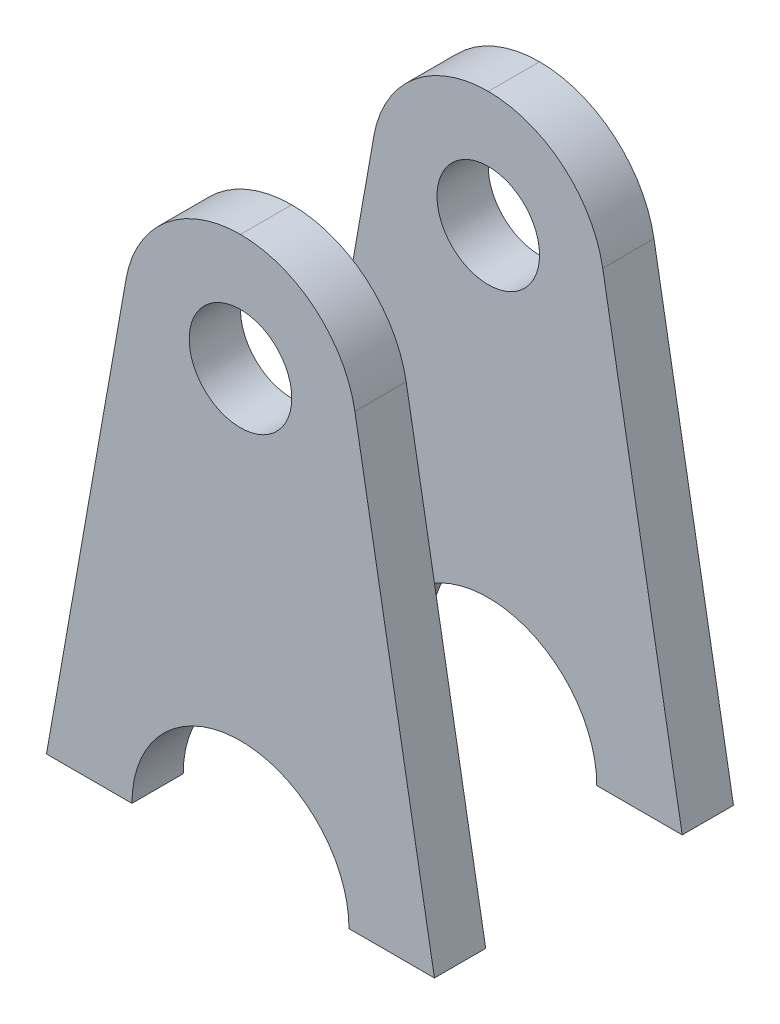
ISO-10303-21;
HEADER;
FILE_DESCRIPTION(('STEP AP214'),'2;1');
FILE_NAME('part.step','',(''),(''),'','','');
FILE_SCHEMA(('AUTOMOTIVE_DESIGN { 1 0 10303 214 1 1 1 1 }'));
ENDSEC;
DATA;
#1=APPLICATION_CONTEXT('core data for automotive mechanical design processes');
#2=APPLICATION_PROTOCOL_DEFINITION('international standard','automotive_design',2000,#1);
#3=PRODUCT_CONTEXT('',#1,'mechanical');
#4=PRODUCT('Part','Part','',(#3));
#5=PRODUCT_RELATED_PRODUCT_CATEGORY('part','',(#4));
#6=PRODUCT_DEFINITION_FORMATION('','',#4);
#7=PRODUCT_DEFINITION_CONTEXT('part definition',#1,'design');
#8=PRODUCT_DEFINITION('design','',#6,#7);
#9=PRODUCT_DEFINITION_SHAPE('','',#8);
#10=(LENGTH_UNIT() NAMED_UNIT(*) SI_UNIT(.MILLI.,.METRE.));
#11=(NAMED_UNIT(*) PLANE_ANGLE_UNIT() SI_UNIT($,.RADIAN.));
#12=(NAMED_UNIT(*) SI_UNIT($,.STERADIAN.) SOLID_ANGLE_UNIT());
#13=UNCERTAINTY_MEASURE_WITH_UNIT(LENGTH_MEASURE(1.E-05),#10,'distance_accuracy_value','');
#14=(GEOMETRIC_REPRESENTATION_CONTEXT(3) GLOBAL_UNCERTAINTY_ASSIGNED_CONTEXT((#13)) GLOBAL_UNIT_ASSIGNED_CONTEXT((#10,
#11,#12)) REPRESENTATION_CONTEXT('',''));
#15=CARTESIAN_POINT('',(0.,0.,0.));
#16=DIRECTION('',(0.,0.,1.));
#17=DIRECTION('',(1.,0.,0.));
#18=AXIS2_PLACEMENT_3D('',#15,#16,#17);
#19=CARTESIAN_POINT('',(0.,64.0125039457935,-29.));
#20=DIRECTION('',(0.,1.,0.));
#21=DIRECTION('',(0.,0.,-1.));
#22=AXIS2_PLACEMENT_3D('',#19,#20,#21);
#23=PLANE('',#22);
#24=DIRECTION('',(1.,0.,0.));
#25=VECTOR('',#24,1.);
#26=CARTESIAN_POINT('',(0.,64.0125039457935,-23.));
#27=LINE('',#26,#25);
#28=CARTESIAN_POINT('',(55.1993694108853,64.0125039457935,-23.));
#29=VERTEX_POINT('',#28);
#30=CARTESIAN_POINT('',(55.2015963461622,64.0125039457935,-23.));
#31=VERTEX_POINT('',#30);
#32=EDGE_CURVE('E153',#29,#31,#27,.T.);
#33=ORIENTED_EDGE('',*,*,#32,.T.);
#34=DIRECTION('',(0.,0.,1.));
#35=VECTOR('',#34,1.);
#36=CARTESIAN_POINT('',(55.2015963461622,64.0125039457935,-29.));
#37=LINE('',#36,#35);
#38=CARTESIAN_POINT('',(55.2015963461622,64.0125039457935,-29.));
#39=VERTEX_POINT('',#38);
#40=EDGE_CURVE('E149',#39,#31,#37,.T.);
#41=ORIENTED_EDGE('',*,*,#40,.F.);
#42=DIRECTION('',(1.,0.,0.));
#43=VECTOR('',#42,1.);
#44=CARTESIAN_POINT('',(0.,64.0125039457935,-29.));
#45=LINE('',#44,#43);
#46=CARTESIAN_POINT('',(55.1993694108853,64.0125039457935,-29.));
#47=VERTEX_POINT('',#46);
#48=EDGE_CURVE('E190',#47,#39,#45,.T.);
#49=ORIENTED_EDGE('',*,*,#48,.F.);
#50=DIRECTION('',(0.,0.,1.));
#51=VECTOR('',#50,1.);
#52=CARTESIAN_POINT('',(55.1993694108853,64.0125039457935,-29.));
#53=LINE('',#52,#51);
#54=EDGE_CURVE('E12',#47,#29,#53,.T.);
#55=ORIENTED_EDGE('',*,*,#54,.T.);
#56=EDGE_LOOP('',(#33,#41,#49,#55));
#57=FACE_BOUND('',#56,.T.);
#58=ADVANCED_FACE('F53',(#57),#23,.T.);
#59=CARTESIAN_POINT('',(55.1993694108852,50.4125039457935,-29.));
#60=DIRECTION('',(0.,0.,1.));
#61=DIRECTION('',(-1.,0.,0.));
#62=AXIS2_PLACEMENT_3D('',#59,#60,#61);
#63=CYLINDRICAL_SURFACE('',#62,13.6);
#64=CARTESIAN_POINT('',(55.1993694108852,50.4125039457935,-23.));
#65=DIRECTION('',(0.,0.,1.));
#66=DIRECTION('',(1.,0.,0.));
#67=AXIS2_PLACEMENT_3D('',#64,#65,#66);
#68=CIRCLE('',#67,13.6);
#69=CARTESIAN_POINT('',(41.8059839699192,52.7741191620637,-23.));
#70=VERTEX_POINT('',#69);
#71=EDGE_CURVE('E156',#29,#70,#68,.T.);
#72=ORIENTED_EDGE('',*,*,#71,.F.);
#73=ORIENTED_EDGE('',*,*,#54,.F.);
#74=CARTESIAN_POINT('',(55.1993694108852,50.4125039457935,-29.));
#75=DIRECTION('',(0.,0.,1.));
#76=DIRECTION('',(1.,0.,0.));
#77=AXIS2_PLACEMENT_3D('',#74,#75,#76);
#78=CIRCLE('',#77,13.6);
#79=CARTESIAN_POINT('',(41.8059839699192,52.7741191620637,-29.));
#80=VERTEX_POINT('',#79);
#81=EDGE_CURVE('E108',#47,#80,#78,.T.);
#82=ORIENTED_EDGE('',*,*,#81,.T.);
#83=DIRECTION('',(0.,0.,1.));
#84=VECTOR('',#83,1.);
#85=CARTESIAN_POINT('',(41.8059839699192,52.7741191620637,-29.));
#86=LINE('',#85,#84);
#87=EDGE_CURVE('E62',#80,#70,#86,.T.);
#88=ORIENTED_EDGE('',*,*,#87,.T.);
#89=EDGE_LOOP('',(#72,#73,#82,#88));
#90=FACE_BOUND('',#89,.T.);
#91=ADVANCED_FACE('F182',(#90),#63,.T.);
#92=CARTESIAN_POINT('',(31.5204734057258,-5.557909906133,-29.));
#93=DIRECTION('',(-0.984807753012208,0.173648177666927,0.));
#94=DIRECTION('',(-0.173648177666927,-0.984807753012209,0.));
#95=AXIS2_PLACEMENT_3D('',#92,#93,#94);
#96=PLANE('',#95);
#97=DIRECTION('',(0.173648177666927,0.984807753012209,0.));
#98=VECTOR('',#97,1.);
#99=CARTESIAN_POINT('',(31.5204734057258,-5.557909906133,-23.));
#100=LINE('',#99,#98);
#101=CARTESIAN_POINT('',(32.5004828785239,0.,-23.));
#102=VERTEX_POINT('',#101);
#103=EDGE_CURVE('E159',#102,#70,#100,.T.);
#104=ORIENTED_EDGE('',*,*,#103,.T.);
#105=ORIENTED_EDGE('',*,*,#87,.F.);
#106=DIRECTION('',(0.173648177666927,0.984807753012209,0.));
#107=VECTOR('',#106,1.);
#108=CARTESIAN_POINT('',(31.5204734057258,-5.557909906133,-29.));
#109=LINE('',#108,#107);
#110=CARTESIAN_POINT('',(32.5004828785239,0.,-29.));
#111=VERTEX_POINT('',#110);
#112=EDGE_CURVE('E192',#111,#80,#109,.T.);
#113=ORIENTED_EDGE('',*,*,#112,.F.);
#114=DIRECTION('',(0.,0.,1.));
#115=VECTOR('',#114,1.);
#116=CARTESIAN_POINT('',(32.5004828785239,0.,-29.));
#117=LINE('',#116,#115);
#118=EDGE_CURVE('E177',#111,#102,#117,.T.);
#119=ORIENTED_EDGE('',*,*,#118,.T.);
#120=EDGE_LOOP('',(#104,#105,#113,#119));
#121=FACE_BOUND('',#120,.T.);
#122=ADVANCED_FACE('F205',(#121),#96,.T.);
#123=CARTESIAN_POINT('',(0.,0.,-29.));
#124=DIRECTION('',(0.,1.,0.));
#125=DIRECTION('',(0.,0.,-1.));
#126=AXIS2_PLACEMENT_3D('',#123,#124,#125);
#127=PLANE('',#126);
#128=DIRECTION('',(1.,0.,0.));
#129=VECTOR('',#128,1.);
#130=CARTESIAN_POINT('',(0.,0.,-23.));
#131=LINE('',#130,#129);
#132=CARTESIAN_POINT('',(42.5004828785239,0.,-23.));
#133=VERTEX_POINT('',#132);
#134=EDGE_CURVE('E161',#102,#133,#131,.T.);
#135=ORIENTED_EDGE('',*,*,#134,.F.);
#136=ORIENTED_EDGE('',*,*,#118,.F.);
#137=DIRECTION('',(1.,0.,0.));
#138=VECTOR('',#137,1.);
#139=CARTESIAN_POINT('',(0.,0.,-29.));
#140=LINE('',#139,#138);
#141=CARTESIAN_POINT('',(42.5004828785239,0.,-29.));
#142=VERTEX_POINT('',#141);
#143=EDGE_CURVE('E144',#111,#142,#140,.T.);
#144=ORIENTED_EDGE('',*,*,#143,.T.);
#145=DIRECTION('',(0.,0.,1.));
#146=VECTOR('',#145,1.);
#147=CARTESIAN_POINT('',(42.5004828785239,0.,-29.));
#148=LINE('',#147,#146);
#149=EDGE_CURVE('E174',#142,#133,#148,.T.);
#150=ORIENTED_EDGE('',*,*,#149,.T.);
#151=EDGE_LOOP('',(#135,#136,#144,#150));
#152=FACE_BOUND('',#151,.T.);
#153=ADVANCED_FACE('F200',(#152),#127,.F.);
#154=CARTESIAN_POINT('',(55.2004828785239,0.,-29.));
#155=DIRECTION('',(0.,0.,1.));
#156=DIRECTION('',(-1.,0.,0.));
#157=AXIS2_PLACEMENT_3D('',#154,#155,#156);
#158=CYLINDRICAL_SURFACE('',#157,12.7);
#159=CARTESIAN_POINT('',(55.2004828785239,0.,-23.));
#160=DIRECTION('',(0.,0.,1.));
#161=DIRECTION('',(1.,0.,0.));
#162=AXIS2_PLACEMENT_3D('',#159,#160,#161);
#163=CIRCLE('',#162,12.7);
#164=CARTESIAN_POINT('',(67.9004828785239,0.,-23.));
#165=VERTEX_POINT('',#164);
#166=EDGE_CURVE('E164',#165,#133,#163,.T.);
#167=ORIENTED_EDGE('',*,*,#166,.T.);
#168=ORIENTED_EDGE('',*,*,#149,.F.);
#169=CARTESIAN_POINT('',(55.2004828785239,0.,-29.));
#170=DIRECTION('',(0.,0.,1.));
#171=DIRECTION('',(1.,0.,0.));
#172=AXIS2_PLACEMENT_3D('',#169,#170,#171);
#173=CIRCLE('',#172,12.7);
#174=CARTESIAN_POINT('',(67.9004828785239,0.,-29.));
#175=VERTEX_POINT('',#174);
#176=EDGE_CURVE('E142',#175,#142,#173,.T.);
#177=ORIENTED_EDGE('',*,*,#176,.F.);
#178=DIRECTION('',(0.,0.,1.));
#179=VECTOR('',#178,1.);
#180=CARTESIAN_POINT('',(67.9004828785239,0.,-29.));
#181=LINE('',#180,#179);
#182=EDGE_CURVE('E136',#175,#165,#181,.T.);
#183=ORIENTED_EDGE('',*,*,#182,.T.);
#184=EDGE_LOOP('',(#167,#168,#177,#183));
#185=FACE_BOUND('',#184,.T.);
#186=ADVANCED_FACE('F203',(#185),#158,.F.);
#187=CARTESIAN_POINT('',(0.,0.,-29.));
#188=DIRECTION('',(0.,1.,0.));
#189=DIRECTION('',(0.,0.,-1.));
#190=AXIS2_PLACEMENT_3D('',#187,#188,#189);
#191=PLANE('',#190);
#192=DIRECTION('',(1.,0.,0.));
#193=VECTOR('',#192,1.);
#194=CARTESIAN_POINT('',(0.,0.,-23.));
#195=LINE('',#194,#193);
#196=CARTESIAN_POINT('',(77.9004828785239,0.,-23.));
#197=VERTEX_POINT('',#196);
#198=EDGE_CURVE('E166',#165,#197,#195,.T.);
#199=ORIENTED_EDGE('',*,*,#198,.F.);
#200=ORIENTED_EDGE('',*,*,#182,.F.);
#201=DIRECTION('',(1.,0.,0.));
#202=VECTOR('',#201,1.);
#203=CARTESIAN_POINT('',(0.,0.,-29.));
#204=LINE('',#203,#202);
#205=CARTESIAN_POINT('',(77.9004828785239,0.,-29.));
#206=VERTEX_POINT('',#205);
#207=EDGE_CURVE('E126',#175,#206,#204,.T.);
#208=ORIENTED_EDGE('',*,*,#207,.T.);
#209=DIRECTION('',(0.,0.,1.));
#210=VECTOR('',#209,1.);
#211=CARTESIAN_POINT('',(77.9004828785239,0.,-29.));
#212=LINE('',#211,#210);
#213=EDGE_CURVE('E131',#206,#197,#212,.T.);
#214=ORIENTED_EDGE('',*,*,#213,.T.);
#215=EDGE_LOOP('',(#199,#200,#208,#214));
#216=FACE_BOUND('',#215,.T.);
#217=ADVANCED_FACE('F139',(#216),#191,.F.);
#218=CARTESIAN_POINT('',(75.5514958975658,13.3217671596261,-29.));
#219=DIRECTION('',(-0.984807753012207,-0.173648177666935,0.));
#220=DIRECTION('',(0.173648177666935,-0.984807753012207,0.));
#221=AXIS2_PLACEMENT_3D('',#218,#219,#220);
#222=PLANE('',#221);
#223=DIRECTION('',(-0.173648177666935,0.984807753012207,0.));
#224=VECTOR('',#223,1.);
#225=CARTESIAN_POINT('',(75.5514958975658,13.3217671596261,-23.));
#226=LINE('',#225,#224);
#227=CARTESIAN_POINT('',(68.5949817871282,52.7741191620638,-23.));
#228=VERTEX_POINT('',#227);
#229=EDGE_CURVE('E133',#197,#228,#226,.T.);
#230=ORIENTED_EDGE('',*,*,#229,.F.);
#231=ORIENTED_EDGE('',*,*,#213,.F.);
#232=DIRECTION('',(-0.173648177666935,0.984807753012207,0.));
#233=VECTOR('',#232,1.);
#234=CARTESIAN_POINT('',(75.5514958975658,13.3217671596261,-29.));
#235=LINE('',#234,#233);
#236=CARTESIAN_POINT('',(68.5949817871282,52.7741191620638,-29.));
#237=VERTEX_POINT('',#236);
#238=EDGE_CURVE('E122',#206,#237,#235,.T.);
#239=ORIENTED_EDGE('',*,*,#238,.T.);
#240=DIRECTION('',(0.,0.,1.));
#241=VECTOR('',#240,1.);
#242=CARTESIAN_POINT('',(68.5949817871282,52.7741191620638,-29.));
#243=LINE('',#242,#241);
#244=EDGE_CURVE('E137',#237,#228,#243,.T.);
#245=ORIENTED_EDGE('',*,*,#244,.T.);
#246=EDGE_LOOP('',(#230,#231,#239,#245));
#247=FACE_BOUND('',#246,.T.);
#248=ADVANCED_FACE('F132',(#247),#222,.F.);
#249=CARTESIAN_POINT('',(55.2015963461622,50.4125039457935,-29.));
#250=DIRECTION('',(0.,0.,1.));
#251=DIRECTION('',(-1.,0.,0.));
#252=AXIS2_PLACEMENT_3D('',#249,#250,#251);
#253=CYLINDRICAL_SURFACE('',#252,6.00000000000001);
#254=CARTESIAN_POINT('',(55.2015963461622,50.4125039457935,-29.));
#255=DIRECTION('',(0.,0.,1.));
#256=DIRECTION('',(1.,0.,0.));
#257=AXIS2_PLACEMENT_3D('',#254,#255,#256);
#258=CIRCLE('',#257,6.00000000000001);
#259=CARTESIAN_POINT('',(61.2015963461622,50.4125039457935,-29.));
#260=VERTEX_POINT('',#259);
#261=EDGE_CURVE('E170',#260,#260,#258,.T.);
#262=ORIENTED_EDGE('',*,*,#261,.F.);
#263=EDGE_LOOP('',(#262));
#264=FACE_BOUND('',#263,.T.);
#265=CARTESIAN_POINT('',(55.2015963461622,50.4125039457935,-23.));
#266=DIRECTION('',(0.,0.,1.));
#267=DIRECTION('',(1.,0.,0.));
#268=AXIS2_PLACEMENT_3D('',#265,#266,#267);
#269=CIRCLE('',#268,6.00000000000001);
#270=CARTESIAN_POINT('',(61.2015963461622,50.4125039457935,-23.));
#271=VERTEX_POINT('',#270);
#272=EDGE_CURVE('E150',#271,#271,#269,.T.);
#273=ORIENTED_EDGE('',*,*,#272,.T.);
#274=EDGE_LOOP('',(#273));
#275=FACE_BOUND('',#274,.T.);
#276=ADVANCED_FACE('F55',(#264,#275),#253,.F.);
#277=CARTESIAN_POINT('',(55.2015963461622,50.4125039457935,-29.));
#278=DIRECTION('',(0.,0.,1.));
#279=DIRECTION('',(-1.,0.,0.));
#280=AXIS2_PLACEMENT_3D('',#277,#278,#279);
#281=CYLINDRICAL_SURFACE('',#280,13.6);
#282=CARTESIAN_POINT('',(55.2015963461622,50.4125039457935,-23.));
#283=DIRECTION('',(0.,0.,1.));
#284=DIRECTION('',(1.,0.,0.));
#285=AXIS2_PLACEMENT_3D('',#282,#283,#284);
#286=CIRCLE('',#285,13.6);
#287=EDGE_CURVE('E96',#31,#228,#286,.F.);
#288=ORIENTED_EDGE('',*,*,#287,.T.);
#289=ORIENTED_EDGE('',*,*,#244,.F.);
#290=CARTESIAN_POINT('',(55.2015963461622,50.4125039457935,-29.));
#291=DIRECTION('',(0.,0.,1.));
#292=DIRECTION('',(1.,0.,0.));
#293=AXIS2_PLACEMENT_3D('',#290,#291,#292);
#294=CIRCLE('',#293,13.6);
#295=EDGE_CURVE('E70',#39,#237,#294,.F.);
#296=ORIENTED_EDGE('',*,*,#295,.F.);
#297=ORIENTED_EDGE('',*,*,#40,.T.);
#298=EDGE_LOOP('',(#288,#289,#296,#297));
#299=FACE_BOUND('',#298,.T.);
#300=ADVANCED_FACE('F264',(#299),#281,.T.);
#301=CARTESIAN_POINT('',(0.,0.,-29.));
#302=DIRECTION('',(0.,0.,-1.));
#303=DIRECTION('',(1.,0.,0.));
#304=AXIS2_PLACEMENT_3D('',#301,#302,#303);
#305=PLANE('',#304);
#306=ORIENTED_EDGE('',*,*,#261,.T.);
#307=EDGE_LOOP('',(#306));
#308=FACE_BOUND('',#307,.T.);
#309=ORIENTED_EDGE('',*,*,#48,.T.);
#310=ORIENTED_EDGE('',*,*,#295,.T.);
#311=ORIENTED_EDGE('',*,*,#238,.F.);
#312=ORIENTED_EDGE('',*,*,#207,.F.);
#313=ORIENTED_EDGE('',*,*,#176,.T.);
#314=ORIENTED_EDGE('',*,*,#143,.F.);
#315=ORIENTED_EDGE('',*,*,#112,.T.);
#316=ORIENTED_EDGE('',*,*,#81,.F.);
#317=EDGE_LOOP('',(#309,#310,#311,#312,#313,#314,#315,#316));
#318=FACE_BOUND('',#317,.T.);
#319=ADVANCED_FACE('F124',(#308,#318),#305,.T.);
#320=CARTESIAN_POINT('',(0.,0.,-23.));
#321=DIRECTION('',(0.,0.,-1.));
#322=DIRECTION('',(1.,0.,0.));
#323=AXIS2_PLACEMENT_3D('',#320,#321,#322);
#324=PLANE('',#323);
#325=ORIENTED_EDGE('',*,*,#272,.F.);
#326=EDGE_LOOP('',(#325));
#327=FACE_BOUND('',#326,.T.);
#328=ORIENTED_EDGE('',*,*,#32,.F.);
#329=ORIENTED_EDGE('',*,*,#71,.T.);
#330=ORIENTED_EDGE('',*,*,#103,.F.);
#331=ORIENTED_EDGE('',*,*,#134,.T.);
#332=ORIENTED_EDGE('',*,*,#166,.F.);
#333=ORIENTED_EDGE('',*,*,#198,.T.);
#334=ORIENTED_EDGE('',*,*,#229,.T.);
#335=ORIENTED_EDGE('',*,*,#287,.F.);
#336=EDGE_LOOP('',(#328,#329,#330,#331,#332,#333,#334,#335));
#337=FACE_BOUND('',#336,.T.);
#338=ADVANCED_FACE('F186',(#327,#337),#324,.F.);
#339=CLOSED_SHELL('',(#58,#91,#122,#153,#186,#217,#248,#276,#300,#319,#338));
#340=MANIFOLD_SOLID_BREP('B2',#339);
#341=CARTESIAN_POINT('',(0.,64.0125039457935,6.));
#342=DIRECTION('',(0.,1.,0.));
#343=DIRECTION('',(0.,0.,1.));
#344=AXIS2_PLACEMENT_3D('',#341,#342,#343);
#345=PLANE('',#344);
#346=DIRECTION('',(1.,0.,0.));
#347=VECTOR('',#346,1.);
#348=CARTESIAN_POINT('',(0.,64.0125039457935,0.));
#349=LINE('',#348,#347);
#350=CARTESIAN_POINT('',(55.1993694108853,64.0125039457935,0.));
#351=VERTEX_POINT('',#350);
#352=CARTESIAN_POINT('',(55.2015963461622,64.0125039457935,0.));
#353=VERTEX_POINT('',#352);
#354=EDGE_CURVE('E465',#351,#353,#349,.T.);
#355=ORIENTED_EDGE('',*,*,#354,.F.);
#356=DIRECTION('',(0.,0.,-1.));
#357=VECTOR('',#356,1.);
#358=CARTESIAN_POINT('',(55.1993694108853,64.0125039457935,6.));
#359=LINE('',#358,#357);
#360=CARTESIAN_POINT('',(55.1993694108853,64.0125039457935,6.));
#361=VERTEX_POINT('',#360);
#362=EDGE_CURVE('E51',#361,#351,#359,.T.);
#363=ORIENTED_EDGE('',*,*,#362,.F.);
#364=DIRECTION('',(1.,0.,0.));
#365=VECTOR('',#364,1.);
#366=CARTESIAN_POINT('',(0.,64.0125039457935,6.));
#367=LINE('',#366,#365);
#368=CARTESIAN_POINT('',(55.2015963461622,64.0125039457935,6.));
#369=VERTEX_POINT('',#368);
#370=EDGE_CURVE('E641',#361,#369,#367,.T.);
#371=ORIENTED_EDGE('',*,*,#370,.T.);
#372=DIRECTION('',(0.,0.,-1.));
#373=VECTOR('',#372,1.);
#374=CARTESIAN_POINT('',(55.2015963461622,64.0125039457935,6.));
#375=LINE('',#374,#373);
#376=EDGE_CURVE('E369',#369,#353,#375,.T.);
#377=ORIENTED_EDGE('',*,*,#376,.T.);
#378=EDGE_LOOP('',(#355,#363,#371,#377));
#379=FACE_BOUND('',#378,.T.);
#380=ADVANCED_FACE('F352',(#379),#345,.T.);
#381=CARTESIAN_POINT('',(55.1993694108852,50.4125039457935,6.));
#382=DIRECTION('',(0.,0.,-1.));
#383=DIRECTION('',(-1.,0.,0.));
#384=AXIS2_PLACEMENT_3D('',#381,#382,#383);
#385=CYLINDRICAL_SURFACE('',#384,13.6);
#386=CARTESIAN_POINT('',(55.1993694108852,50.4125039457935,0.));
#387=DIRECTION('',(0.,0.,1.));
#388=DIRECTION('',(1.,0.,0.));
#389=AXIS2_PLACEMENT_3D('',#386,#387,#388);
#390=CIRCLE('',#389,13.6);
#391=CARTESIAN_POINT('',(41.8059839699192,52.7741191620637,0.));
#392=VERTEX_POINT('',#391);
#393=EDGE_CURVE('E462',#351,#392,#390,.T.);
#394=ORIENTED_EDGE('',*,*,#393,.T.);
#395=DIRECTION('',(0.,0.,-1.));
#396=VECTOR('',#395,1.);
#397=CARTESIAN_POINT('',(41.8059839699192,52.7741191620637,6.));
#398=LINE('',#397,#396);
#399=CARTESIAN_POINT('',(41.8059839699192,52.7741191620637,6.));
#400=VERTEX_POINT('',#399);
#401=EDGE_CURVE('E361',#400,#392,#398,.T.);
#402=ORIENTED_EDGE('',*,*,#401,.F.);
#403=CARTESIAN_POINT('',(55.1993694108852,50.4125039457935,6.));
#404=DIRECTION('',(0.,0.,1.));
#405=DIRECTION('',(1.,0.,0.));
#406=AXIS2_PLACEMENT_3D('',#403,#404,#405);
#407=CIRCLE('',#406,13.6);
#408=EDGE_CURVE('E639',#361,#400,#407,.T.);
#409=ORIENTED_EDGE('',*,*,#408,.F.);
#410=ORIENTED_EDGE('',*,*,#362,.T.);
#411=EDGE_LOOP('',(#394,#402,#409,#410));
#412=FACE_BOUND('',#411,.T.);
#413=ADVANCED_FACE('F463',(#412),#385,.T.);
#414=CARTESIAN_POINT('',(31.5204734057258,-5.557909906133,6.));
#415=DIRECTION('',(-0.984807753012208,0.173648177666927,0.));
#416=DIRECTION('',(-0.173648177666927,-0.984807753012209,0.));
#417=AXIS2_PLACEMENT_3D('',#414,#415,#416);
#418=PLANE('',#417);
#419=DIRECTION('',(0.173648177666927,0.984807753012209,0.));
#420=VECTOR('',#419,1.);
#421=CARTESIAN_POINT('',(31.5204734057258,-5.557909906133,0.));
#422=LINE('',#421,#420);
#423=CARTESIAN_POINT('',(32.5004828785239,0.,0.));
#424=VERTEX_POINT('',#423);
#425=EDGE_CURVE('E457',#424,#392,#422,.T.);
#426=ORIENTED_EDGE('',*,*,#425,.F.);
#427=DIRECTION('',(0.,0.,-1.));
#428=VECTOR('',#427,1.);
#429=CARTESIAN_POINT('',(32.5004828785239,0.,6.));
#430=LINE('',#429,#428);
#431=CARTESIAN_POINT('',(32.5004828785239,0.,6.));
#432=VERTEX_POINT('',#431);
#433=EDGE_CURVE('E449',#432,#424,#430,.T.);
#434=ORIENTED_EDGE('',*,*,#433,.F.);
#435=DIRECTION('',(0.173648177666927,0.984807753012209,0.));
#436=VECTOR('',#435,1.);
#437=CARTESIAN_POINT('',(31.5204734057258,-5.557909906133,6.));
#438=LINE('',#437,#436);
#439=EDGE_CURVE('E459',#432,#400,#438,.T.);
#440=ORIENTED_EDGE('',*,*,#439,.T.);
#441=ORIENTED_EDGE('',*,*,#401,.T.);
#442=EDGE_LOOP('',(#426,#434,#440,#441));
#443=FACE_BOUND('',#442,.T.);
#444=ADVANCED_FACE('F455',(#443),#418,.T.);
#445=CARTESIAN_POINT('',(0.,0.,6.));
#446=DIRECTION('',(0.,1.,0.));
#447=DIRECTION('',(0.,0.,1.));
#448=AXIS2_PLACEMENT_3D('',#445,#446,#447);
#449=PLANE('',#448);
#450=DIRECTION('',(1.,0.,0.));
#451=VECTOR('',#450,1.);
#452=CARTESIAN_POINT('',(0.,0.,0.));
#453=LINE('',#452,#451);
#454=CARTESIAN_POINT('',(42.5004828785239,0.,0.));
#455=VERTEX_POINT('',#454);
#456=EDGE_CURVE('E471',#424,#455,#453,.T.);
#457=ORIENTED_EDGE('',*,*,#456,.T.);
#458=DIRECTION('',(0.,0.,-1.));
#459=VECTOR('',#458,1.);
#460=CARTESIAN_POINT('',(42.5004828785239,0.,6.));
#461=LINE('',#460,#459);
#462=CARTESIAN_POINT('',(42.5004828785239,0.,6.));
#463=VERTEX_POINT('',#462);
#464=EDGE_CURVE('E443',#463,#455,#461,.T.);
#465=ORIENTED_EDGE('',*,*,#464,.F.);
#466=DIRECTION('',(1.,0.,0.));
#467=VECTOR('',#466,1.);
#468=CARTESIAN_POINT('',(0.,0.,6.));
#469=LINE('',#468,#467);
#470=EDGE_CURVE('E637',#432,#463,#469,.T.);
#471=ORIENTED_EDGE('',*,*,#470,.F.);
#472=ORIENTED_EDGE('',*,*,#433,.T.);
#473=EDGE_LOOP('',(#457,#465,#471,#472));
#474=FACE_BOUND('',#473,.T.);
#475=ADVANCED_FACE('F508',(#474),#449,.F.);
#476=CARTESIAN_POINT('',(55.2004828785239,0.,6.));
#477=DIRECTION('',(0.,0.,-1.));
#478=DIRECTION('',(-1.,0.,0.));
#479=AXIS2_PLACEMENT_3D('',#476,#477,#478);
#480=CYLINDRICAL_SURFACE('',#479,12.7);
#481=CARTESIAN_POINT('',(55.2004828785239,0.,0.));
#482=DIRECTION('',(0.,0.,1.));
#483=DIRECTION('',(1.,0.,0.));
#484=AXIS2_PLACEMENT_3D('',#481,#482,#483);
#485=CIRCLE('',#484,12.7);
#486=CARTESIAN_POINT('',(67.9004828785239,0.,0.));
#487=VERTEX_POINT('',#486);
#488=EDGE_CURVE('E473',#487,#455,#485,.T.);
#489=ORIENTED_EDGE('',*,*,#488,.F.);
#490=DIRECTION('',(0.,0.,-1.));
#491=VECTOR('',#490,1.);
#492=CARTESIAN_POINT('',(67.9004828785239,0.,6.));
#493=LINE('',#492,#491);
#494=CARTESIAN_POINT('',(67.9004828785239,0.,6.));
#495=VERTEX_POINT('',#494);
#496=EDGE_CURVE('E441',#495,#487,#493,.T.);
#497=ORIENTED_EDGE('',*,*,#496,.F.);
#498=CARTESIAN_POINT('',(55.2004828785239,0.,6.));
#499=DIRECTION('',(0.,0.,1.));
#500=DIRECTION('',(1.,0.,0.));
#501=AXIS2_PLACEMENT_3D('',#498,#499,#500);
#502=CIRCLE('',#501,12.7);
#503=EDGE_CURVE('E435',#495,#463,#502,.T.);
#504=ORIENTED_EDGE('',*,*,#503,.T.);
#505=ORIENTED_EDGE('',*,*,#464,.T.);
#506=EDGE_LOOP('',(#489,#497,#504,#505));
#507=FACE_BOUND('',#506,.T.);
#508=ADVANCED_FACE('F511',(#507),#480,.F.);
#509=CARTESIAN_POINT('',(0.,0.,6.));
#510=DIRECTION('',(0.,1.,0.));
#511=DIRECTION('',(0.,0.,1.));
#512=AXIS2_PLACEMENT_3D('',#509,#510,#511);
#513=PLANE('',#512);
#514=DIRECTION('',(1.,0.,0.));
#515=VECTOR('',#514,1.);
#516=CARTESIAN_POINT('',(0.,0.,0.));
#517=LINE('',#516,#515);
#518=CARTESIAN_POINT('',(77.9004828785239,0.,0.));
#519=VERTEX_POINT('',#518);
#520=EDGE_CURVE('E440',#487,#519,#517,.T.);
#521=ORIENTED_EDGE('',*,*,#520,.T.);
#522=DIRECTION('',(0.,0.,-1.));
#523=VECTOR('',#522,1.);
#524=CARTESIAN_POINT('',(77.9004828785239,0.,6.));
#525=LINE('',#524,#523);
#526=CARTESIAN_POINT('',(77.9004828785239,0.,6.));
#527=VERTEX_POINT('',#526);
#528=EDGE_CURVE('E423',#527,#519,#525,.T.);
#529=ORIENTED_EDGE('',*,*,#528,.F.);
#530=DIRECTION('',(1.,0.,0.));
#531=VECTOR('',#530,1.);
#532=CARTESIAN_POINT('',(0.,0.,6.));
#533=LINE('',#532,#531);
#534=EDGE_CURVE('E428',#495,#527,#533,.T.);
#535=ORIENTED_EDGE('',*,*,#534,.F.);
#536=ORIENTED_EDGE('',*,*,#496,.T.);
#537=EDGE_LOOP('',(#521,#529,#535,#536));
#538=FACE_BOUND('',#537,.T.);
#539=ADVANCED_FACE('F438',(#538),#513,.F.);
#540=CARTESIAN_POINT('',(75.5514958975658,13.3217671596261,6.));
#541=DIRECTION('',(-0.984807753012207,-0.173648177666935,0.));
#542=DIRECTION('',(0.173648177666935,-0.984807753012207,0.));
#543=AXIS2_PLACEMENT_3D('',#540,#541,#542);
#544=PLANE('',#543);
#545=DIRECTION('',(-0.173648177666935,0.984807753012207,0.));
#546=VECTOR('',#545,1.);
#547=CARTESIAN_POINT('',(75.5514958975658,13.3217671596261,0.));
#548=LINE('',#547,#546);
#549=CARTESIAN_POINT('',(68.5949817871282,52.7741191620638,0.));
#550=VERTEX_POINT('',#549);
#551=EDGE_CURVE('E479',#519,#550,#548,.T.);
#552=ORIENTED_EDGE('',*,*,#551,.T.);
#553=DIRECTION('',(0.,0.,-1.));
#554=VECTOR('',#553,1.);
#555=CARTESIAN_POINT('',(68.5949817871282,52.7741191620638,6.));
#556=LINE('',#555,#554);
#557=CARTESIAN_POINT('',(68.5949817871282,52.7741191620638,6.));
#558=VERTEX_POINT('',#557);
#559=EDGE_CURVE('E395',#558,#550,#556,.T.);
#560=ORIENTED_EDGE('',*,*,#559,.F.);
#561=DIRECTION('',(-0.173648177666935,0.984807753012207,0.));
#562=VECTOR('',#561,1.);
#563=CARTESIAN_POINT('',(75.5514958975658,13.3217671596261,6.));
#564=LINE('',#563,#562);
#565=EDGE_CURVE('E419',#527,#558,#564,.T.);
#566=ORIENTED_EDGE('',*,*,#565,.F.);
#567=ORIENTED_EDGE('',*,*,#528,.T.);
#568=EDGE_LOOP('',(#552,#560,#566,#567));
#569=FACE_BOUND('',#568,.T.);
#570=ADVANCED_FACE('F421',(#569),#544,.F.);
#571=CARTESIAN_POINT('',(55.2015963461622,50.4125039457935,6.));
#572=DIRECTION('',(0.,0.,-1.));
#573=DIRECTION('',(-1.,0.,0.));
#574=AXIS2_PLACEMENT_3D('',#571,#572,#573);
#575=CYLINDRICAL_SURFACE('',#574,6.00000000000001);
#576=CARTESIAN_POINT('',(55.2015963461622,50.4125039457935,6.));
#577=DIRECTION('',(0.,0.,1.));
#578=DIRECTION('',(1.,0.,0.));
#579=AXIS2_PLACEMENT_3D('',#576,#577,#578);
#580=CIRCLE('',#579,6.00000000000001);
#581=CARTESIAN_POINT('',(61.2015963461622,50.4125039457935,6.));
#582=VERTEX_POINT('',#581);
#583=EDGE_CURVE('E483',#582,#582,#580,.T.);
#584=ORIENTED_EDGE('',*,*,#583,.T.);
#585=EDGE_LOOP('',(#584));
#586=FACE_BOUND('',#585,.T.);
#587=CARTESIAN_POINT('',(55.2015963461622,50.4125039457935,0.));
#588=DIRECTION('',(0.,0.,1.));
#589=DIRECTION('',(1.,0.,0.));
#590=AXIS2_PLACEMENT_3D('',#587,#588,#589);
#591=CIRCLE('',#590,6.00000000000001);
#592=CARTESIAN_POINT('',(61.2015963461622,50.4125039457935,0.));
#593=VERTEX_POINT('',#592);
#594=EDGE_CURVE('E486',#593,#593,#591,.T.);
#595=ORIENTED_EDGE('',*,*,#594,.F.);
#596=EDGE_LOOP('',(#595));
#597=FACE_BOUND('',#596,.T.);
#598=ADVANCED_FACE('F354',(#586,#597),#575,.F.);
#599=CARTESIAN_POINT('',(55.2015963461622,50.4125039457935,6.));
#600=DIRECTION('',(0.,0.,-1.));
#601=DIRECTION('',(-1.,0.,0.));
#602=AXIS2_PLACEMENT_3D('',#599,#600,#601);
#603=CYLINDRICAL_SURFACE('',#602,13.6);
#604=CARTESIAN_POINT('',(55.2015963461622,50.4125039457935,0.));
#605=DIRECTION('',(0.,0.,1.));
#606=DIRECTION('',(1.,0.,0.));
#607=AXIS2_PLACEMENT_3D('',#604,#605,#606);
#608=CIRCLE('',#607,13.6);
#609=EDGE_CURVE('E481',#353,#550,#608,.F.);
#610=ORIENTED_EDGE('',*,*,#609,.F.);
#611=ORIENTED_EDGE('',*,*,#376,.F.);
#612=CARTESIAN_POINT('',(55.2015963461622,50.4125039457935,6.));
#613=DIRECTION('',(0.,0.,1.));
#614=DIRECTION('',(1.,0.,0.));
#615=AXIS2_PLACEMENT_3D('',#612,#613,#614);
#616=CIRCLE('',#615,13.6);
#617=EDGE_CURVE('E427',#369,#558,#616,.F.);
#618=ORIENTED_EDGE('',*,*,#617,.T.);
#619=ORIENTED_EDGE('',*,*,#559,.T.);
#620=EDGE_LOOP('',(#610,#611,#618,#619));
#621=FACE_BOUND('',#620,.T.);
#622=ADVANCED_FACE('F488',(#621),#603,.T.);
#623=CARTESIAN_POINT('',(0.,0.,6.));
#624=DIRECTION('',(0.,0.,1.));
#625=DIRECTION('',(1.,0.,0.));
#626=AXIS2_PLACEMENT_3D('',#623,#624,#625);
#627=PLANE('',#626);
#628=ORIENTED_EDGE('',*,*,#583,.F.);
#629=EDGE_LOOP('',(#628));
#630=FACE_BOUND('',#629,.T.);
#631=ORIENTED_EDGE('',*,*,#370,.F.);
#632=ORIENTED_EDGE('',*,*,#408,.T.);
#633=ORIENTED_EDGE('',*,*,#439,.F.);
#634=ORIENTED_EDGE('',*,*,#470,.T.);
#635=ORIENTED_EDGE('',*,*,#503,.F.);
#636=ORIENTED_EDGE('',*,*,#534,.T.);
#637=ORIENTED_EDGE('',*,*,#565,.T.);
#638=ORIENTED_EDGE('',*,*,#617,.F.);
#639=EDGE_LOOP('',(#631,#632,#633,#634,#635,#636,#637,#638));
#640=FACE_BOUND('',#639,.T.);
#641=ADVANCED_FACE('F433',(#630,#640),#627,.T.);
#642=CARTESIAN_POINT('',(0.,0.,0.));
#643=DIRECTION('',(0.,0.,1.));
#644=DIRECTION('',(1.,0.,0.));
#645=AXIS2_PLACEMENT_3D('',#642,#643,#644);
#646=PLANE('',#645);
#647=ORIENTED_EDGE('',*,*,#594,.T.);
#648=EDGE_LOOP('',(#647));
#649=FACE_BOUND('',#648,.T.);
#650=ORIENTED_EDGE('',*,*,#354,.T.);
#651=ORIENTED_EDGE('',*,*,#609,.T.);
#652=ORIENTED_EDGE('',*,*,#551,.F.);
#653=ORIENTED_EDGE('',*,*,#520,.F.);
#654=ORIENTED_EDGE('',*,*,#488,.T.);
#655=ORIENTED_EDGE('',*,*,#456,.F.);
#656=ORIENTED_EDGE('',*,*,#425,.T.);
#657=ORIENTED_EDGE('',*,*,#393,.F.);
#658=EDGE_LOOP('',(#650,#651,#652,#653,#654,#655,#656,#657));
#659=FACE_BOUND('',#658,.T.);
#660=ADVANCED_FACE('F468',(#649,#659),#646,.F.);
#661=CLOSED_SHELL('',(#380,#413,#444,#475,#508,#539,#570,#598,#622,#641,#660));
#662=MANIFOLD_SOLID_BREP('B6',#661);
#663=ADVANCED_BREP_SHAPE_REPRESENTATION('',(#18,#340,#662),#14);
#664=SHAPE_DEFINITION_REPRESENTATION(#9,#663);
ENDSEC;
END-ISO-10303-21;
